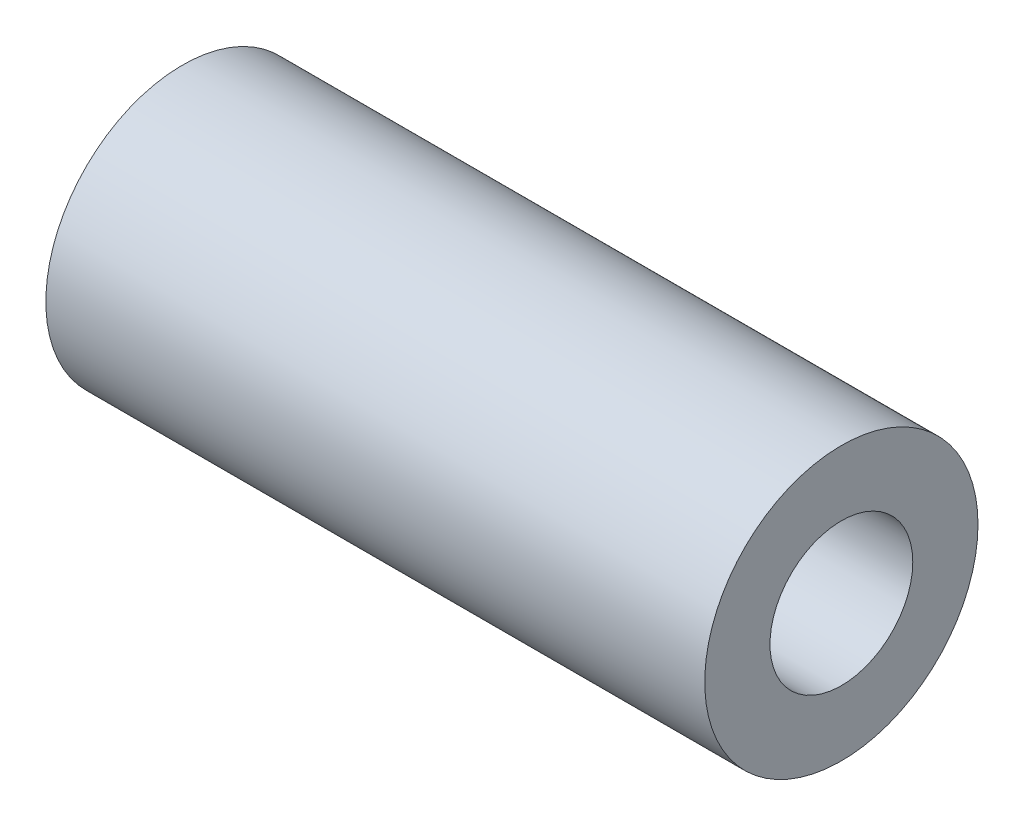
ISO-10303-21;
HEADER;
FILE_DESCRIPTION(('STEP AP214'),'2;1');
FILE_NAME('part.step','',(''),(''),'','','');
FILE_SCHEMA(('AUTOMOTIVE_DESIGN { 1 0 10303 214 1 1 1 1 }'));
ENDSEC;
DATA;
#1=APPLICATION_CONTEXT('core data for automotive mechanical design processes');
#2=APPLICATION_PROTOCOL_DEFINITION('international standard','automotive_design',2000,#1);
#3=PRODUCT_CONTEXT('',#1,'mechanical');
#4=PRODUCT('Part','Part','',(#3));
#5=PRODUCT_RELATED_PRODUCT_CATEGORY('part','',(#4));
#6=PRODUCT_DEFINITION_FORMATION('','',#4);
#7=PRODUCT_DEFINITION_CONTEXT('part definition',#1,'design');
#8=PRODUCT_DEFINITION('design','',#6,#7);
#9=PRODUCT_DEFINITION_SHAPE('','',#8);
#10=(LENGTH_UNIT() NAMED_UNIT(*) SI_UNIT(.MILLI.,.METRE.));
#11=(NAMED_UNIT(*) PLANE_ANGLE_UNIT() SI_UNIT($,.RADIAN.));
#12=(NAMED_UNIT(*) SI_UNIT($,.STERADIAN.) SOLID_ANGLE_UNIT());
#13=UNCERTAINTY_MEASURE_WITH_UNIT(LENGTH_MEASURE(1.E-05),#10,'distance_accuracy_value','');
#14=(GEOMETRIC_REPRESENTATION_CONTEXT(3) GLOBAL_UNCERTAINTY_ASSIGNED_CONTEXT((#13)) GLOBAL_UNIT_ASSIGNED_CONTEXT((#10,
#11,#12)) REPRESENTATION_CONTEXT('',''));
#15=CARTESIAN_POINT('',(0.,0.,0.));
#16=DIRECTION('',(0.,0.,1.));
#17=DIRECTION('',(1.,0.,0.));
#18=AXIS2_PLACEMENT_3D('',#15,#16,#17);
#19=CARTESIAN_POINT('',(11.483975,0.,0.));
#20=DIRECTION('',(1.,0.,0.));
#21=DIRECTION('',(0.,0.,-1.));
#22=AXIS2_PLACEMENT_3D('',#19,#20,#21);
#23=PLANE('',#22);
#24=CARTESIAN_POINT('',(11.483975,0.,0.));
#25=DIRECTION('',(1.,0.,0.));
#26=DIRECTION('',(0.,0.,-1.));
#27=AXIS2_PLACEMENT_3D('',#24,#25,#26);
#28=CIRCLE('',#27,4.7625);
#29=CARTESIAN_POINT('',(11.483975,0.,-4.7625));
#30=VERTEX_POINT('',#29);
#31=EDGE_CURVE('E10',#30,#30,#28,.T.);
#32=ORIENTED_EDGE('',*,*,#31,.T.);
#33=EDGE_LOOP('',(#32));
#34=FACE_BOUND('',#33,.T.);
#35=CARTESIAN_POINT('',(11.483975,0.,0.));
#36=DIRECTION('',(1.,0.,0.));
#37=DIRECTION('',(0.,0.,-1.));
#38=AXIS2_PLACEMENT_3D('',#35,#36,#37);
#39=CIRCLE('',#38,2.4892);
#40=CARTESIAN_POINT('',(11.483975,0.,-2.4892));
#41=VERTEX_POINT('',#40);
#42=EDGE_CURVE('E50',#41,#41,#39,.T.);
#43=ORIENTED_EDGE('',*,*,#42,.F.);
#44=EDGE_LOOP('',(#43));
#45=FACE_BOUND('',#44,.T.);
#46=ADVANCED_FACE('F39',(#34,#45),#23,.T.);
#47=CARTESIAN_POINT('',(-11.483975,0.,0.));
#48=DIRECTION('',(1.,0.,0.));
#49=DIRECTION('',(0.,0.,-1.));
#50=AXIS2_PLACEMENT_3D('',#47,#48,#49);
#51=PLANE('',#50);
#52=CARTESIAN_POINT('',(-11.483975,0.,0.));
#53=DIRECTION('',(1.,0.,0.));
#54=DIRECTION('',(0.,0.,-1.));
#55=AXIS2_PLACEMENT_3D('',#52,#53,#54);
#56=CIRCLE('',#55,4.7625);
#57=CARTESIAN_POINT('',(-11.483975,0.,-4.7625));
#58=VERTEX_POINT('',#57);
#59=EDGE_CURVE('E43',#58,#58,#56,.T.);
#60=ORIENTED_EDGE('',*,*,#59,.F.);
#61=EDGE_LOOP('',(#60));
#62=FACE_BOUND('',#61,.T.);
#63=CARTESIAN_POINT('',(-11.483975,0.,0.));
#64=DIRECTION('',(1.,0.,0.));
#65=DIRECTION('',(0.,0.,-1.));
#66=AXIS2_PLACEMENT_3D('',#63,#64,#65);
#67=CIRCLE('',#66,2.4892);
#68=CARTESIAN_POINT('',(-11.483975,0.,-2.4892));
#69=VERTEX_POINT('',#68);
#70=EDGE_CURVE('E52',#69,#69,#67,.T.);
#71=ORIENTED_EDGE('',*,*,#70,.T.);
#72=EDGE_LOOP('',(#71));
#73=FACE_BOUND('',#72,.T.);
#74=ADVANCED_FACE('F62',(#62,#73),#51,.F.);
#75=CARTESIAN_POINT('',(11.483975,0.,0.));
#76=DIRECTION('',(-1.,0.,0.));
#77=DIRECTION('',(0.,0.,1.));
#78=AXIS2_PLACEMENT_3D('',#75,#76,#77);
#79=CYLINDRICAL_SURFACE('',#78,4.7625);
#80=ORIENTED_EDGE('',*,*,#31,.F.);
#81=EDGE_LOOP('',(#80));
#82=FACE_BOUND('',#81,.T.);
#83=ORIENTED_EDGE('',*,*,#59,.T.);
#84=EDGE_LOOP('',(#83));
#85=FACE_BOUND('',#84,.T.);
#86=ADVANCED_FACE('F41',(#82,#85),#79,.T.);
#87=CARTESIAN_POINT('',(11.483975,0.,0.));
#88=DIRECTION('',(-1.,0.,0.));
#89=DIRECTION('',(0.,0.,1.));
#90=AXIS2_PLACEMENT_3D('',#87,#88,#89);
#91=CYLINDRICAL_SURFACE('',#90,2.4892);
#92=ORIENTED_EDGE('',*,*,#42,.T.);
#93=EDGE_LOOP('',(#92));
#94=FACE_BOUND('',#93,.T.);
#95=ORIENTED_EDGE('',*,*,#70,.F.);
#96=EDGE_LOOP('',(#95));
#97=FACE_BOUND('',#96,.T.);
#98=ADVANCED_FACE('F58',(#94,#97),#91,.F.);
#99=CLOSED_SHELL('',(#46,#74,#86,#98));
#100=MANIFOLD_SOLID_BREP('B2',#99);
#101=ADVANCED_BREP_SHAPE_REPRESENTATION('',(#18,#100),#14);
#102=SHAPE_DEFINITION_REPRESENTATION(#9,#101);
ENDSEC;
END-ISO-10303-21;
